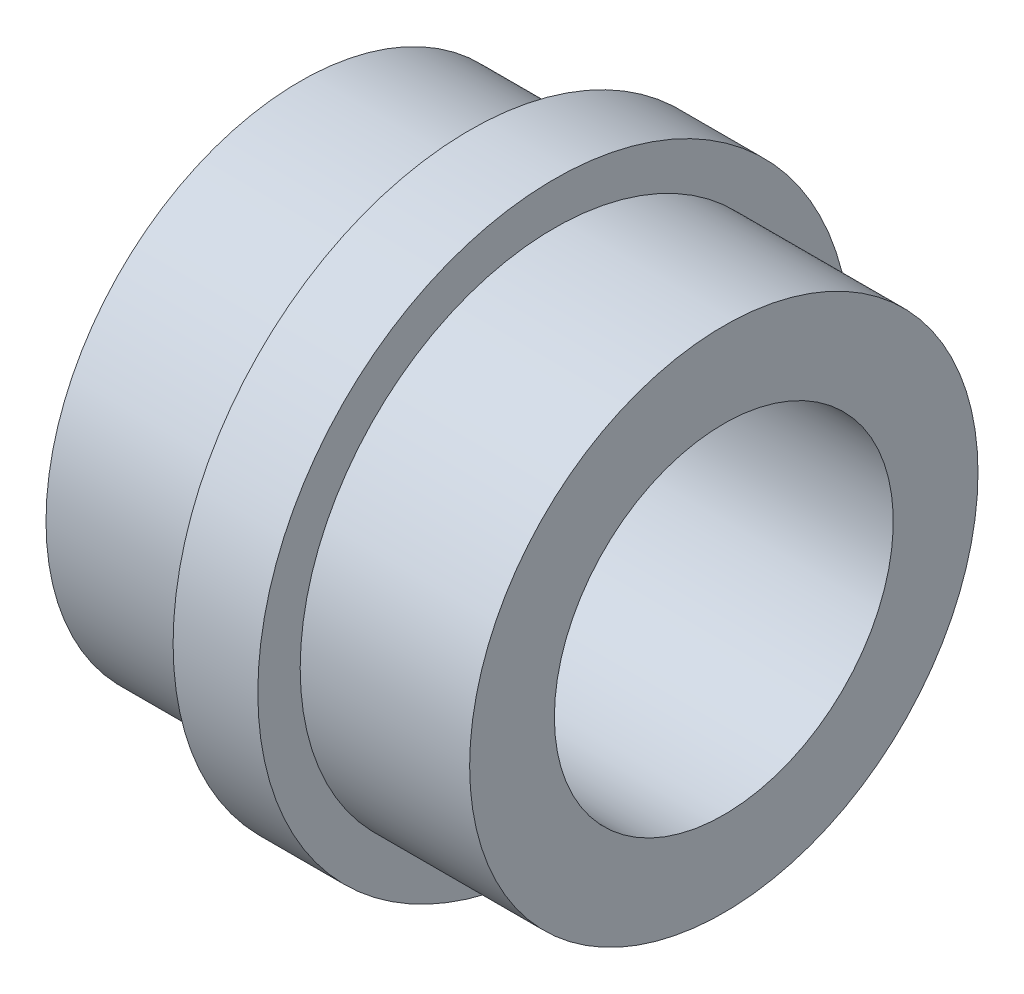
ISO-10303-21;
HEADER;
FILE_DESCRIPTION(('STEP AP214'),'2;1');
FILE_NAME('part.step','',(''),(''),'','','');
FILE_SCHEMA(('AUTOMOTIVE_DESIGN { 1 0 10303 214 1 1 1 1 }'));
ENDSEC;
DATA;
#1=APPLICATION_CONTEXT('core data for automotive mechanical design processes');
#2=APPLICATION_PROTOCOL_DEFINITION('international standard','automotive_design',2000,#1);
#3=PRODUCT_CONTEXT('',#1,'mechanical');
#4=PRODUCT('Part','Part','',(#3));
#5=PRODUCT_RELATED_PRODUCT_CATEGORY('part','',(#4));
#6=PRODUCT_DEFINITION_FORMATION('','',#4);
#7=PRODUCT_DEFINITION_CONTEXT('part definition',#1,'design');
#8=PRODUCT_DEFINITION('design','',#6,#7);
#9=PRODUCT_DEFINITION_SHAPE('','',#8);
#10=(LENGTH_UNIT() NAMED_UNIT(*) SI_UNIT(.MILLI.,.METRE.));
#11=(NAMED_UNIT(*) PLANE_ANGLE_UNIT() SI_UNIT($,.RADIAN.));
#12=(NAMED_UNIT(*) SI_UNIT($,.STERADIAN.) SOLID_ANGLE_UNIT());
#13=UNCERTAINTY_MEASURE_WITH_UNIT(LENGTH_MEASURE(1.E-05),#10,'distance_accuracy_value','');
#14=(GEOMETRIC_REPRESENTATION_CONTEXT(3) GLOBAL_UNCERTAINTY_ASSIGNED_CONTEXT((#13)) GLOBAL_UNIT_ASSIGNED_CONTEXT((#10,
#11,#12)) REPRESENTATION_CONTEXT('',''));
#15=CARTESIAN_POINT('',(0.,0.,0.));
#16=DIRECTION('',(0.,0.,1.));
#17=DIRECTION('',(1.,0.,0.));
#18=AXIS2_PLACEMENT_3D('',#15,#16,#17);
#19=CARTESIAN_POINT('',(0.,0.,-20.));
#20=DIRECTION('',(-1.,0.,0.));
#21=DIRECTION('',(0.,0.,1.));
#22=AXIS2_PLACEMENT_3D('',#19,#20,#21);
#23=PLANE('',#22);
#24=CARTESIAN_POINT('',(0.,0.,0.));
#25=DIRECTION('',(-1.,0.,0.));
#26=DIRECTION('',(0.,0.,1.));
#27=AXIS2_PLACEMENT_3D('',#24,#25,#26);
#28=CIRCLE('',#27,30.);
#29=CARTESIAN_POINT('',(0.,0.,30.));
#30=VERTEX_POINT('',#29);
#31=EDGE_CURVE('E10',#30,#30,#28,.T.);
#32=ORIENTED_EDGE('',*,*,#31,.T.);
#33=EDGE_LOOP('',(#32));
#34=FACE_BOUND('',#33,.T.);
#35=CARTESIAN_POINT('',(0.,0.,0.));
#36=DIRECTION('',(-1.,0.,0.));
#37=DIRECTION('',(0.,0.,1.));
#38=AXIS2_PLACEMENT_3D('',#35,#36,#37);
#39=CIRCLE('',#38,20.);
#40=CARTESIAN_POINT('',(0.,0.,20.));
#41=VERTEX_POINT('',#40);
#42=EDGE_CURVE('E58',#41,#41,#39,.T.);
#43=ORIENTED_EDGE('',*,*,#42,.F.);
#44=EDGE_LOOP('',(#43));
#45=FACE_BOUND('',#44,.T.);
#46=ADVANCED_FACE('F30',(#34,#45),#23,.T.);
#47=CARTESIAN_POINT('',(0.,0.,0.));
#48=DIRECTION('',(-1.,0.,0.));
#49=DIRECTION('',(0.,0.,1.));
#50=AXIS2_PLACEMENT_3D('',#47,#48,#49);
#51=CYLINDRICAL_SURFACE('',#50,30.);
#52=CARTESIAN_POINT('',(20.,0.,0.));
#53=DIRECTION('',(-1.,0.,0.));
#54=DIRECTION('',(0.,0.,1.));
#55=AXIS2_PLACEMENT_3D('',#52,#53,#54);
#56=CIRCLE('',#55,30.);
#57=CARTESIAN_POINT('',(20.,0.,30.));
#58=VERTEX_POINT('',#57);
#59=EDGE_CURVE('E36',#58,#58,#56,.T.);
#60=ORIENTED_EDGE('',*,*,#59,.T.);
#61=EDGE_LOOP('',(#60));
#62=FACE_BOUND('',#61,.T.);
#63=ORIENTED_EDGE('',*,*,#31,.F.);
#64=EDGE_LOOP('',(#63));
#65=FACE_BOUND('',#64,.T.);
#66=ADVANCED_FACE('F65',(#62,#65),#51,.T.);
#67=CARTESIAN_POINT('',(20.,0.,-30.));
#68=DIRECTION('',(-1.,0.,0.));
#69=DIRECTION('',(0.,0.,1.));
#70=AXIS2_PLACEMENT_3D('',#67,#68,#69);
#71=PLANE('',#70);
#72=CARTESIAN_POINT('',(20.,0.,0.));
#73=DIRECTION('',(-1.,0.,0.));
#74=DIRECTION('',(0.,0.,1.));
#75=AXIS2_PLACEMENT_3D('',#72,#73,#74);
#76=CIRCLE('',#75,35.);
#77=CARTESIAN_POINT('',(20.,0.,35.));
#78=VERTEX_POINT('',#77);
#79=EDGE_CURVE('E40',#78,#78,#76,.T.);
#80=ORIENTED_EDGE('',*,*,#79,.T.);
#81=EDGE_LOOP('',(#80));
#82=FACE_BOUND('',#81,.T.);
#83=ORIENTED_EDGE('',*,*,#59,.F.);
#84=EDGE_LOOP('',(#83));
#85=FACE_BOUND('',#84,.T.);
#86=ADVANCED_FACE('F69',(#82,#85),#71,.T.);
#87=CARTESIAN_POINT('',(0.,0.,0.));
#88=DIRECTION('',(-1.,0.,0.));
#89=DIRECTION('',(0.,0.,1.));
#90=AXIS2_PLACEMENT_3D('',#87,#88,#89);
#91=CYLINDRICAL_SURFACE('',#90,35.);
#92=CARTESIAN_POINT('',(30.,0.,0.));
#93=DIRECTION('',(-1.,0.,0.));
#94=DIRECTION('',(0.,0.,1.));
#95=AXIS2_PLACEMENT_3D('',#92,#93,#94);
#96=CIRCLE('',#95,35.);
#97=CARTESIAN_POINT('',(30.,0.,35.));
#98=VERTEX_POINT('',#97);
#99=EDGE_CURVE('E44',#98,#98,#96,.T.);
#100=ORIENTED_EDGE('',*,*,#99,.T.);
#101=EDGE_LOOP('',(#100));
#102=FACE_BOUND('',#101,.T.);
#103=ORIENTED_EDGE('',*,*,#79,.F.);
#104=EDGE_LOOP('',(#103));
#105=FACE_BOUND('',#104,.T.);
#106=ADVANCED_FACE('F73',(#102,#105),#91,.T.);
#107=CARTESIAN_POINT('',(30.,0.,-30.));
#108=DIRECTION('',(-1.,0.,0.));
#109=DIRECTION('',(0.,0.,1.));
#110=AXIS2_PLACEMENT_3D('',#107,#108,#109);
#111=PLANE('',#110);
#112=ORIENTED_EDGE('',*,*,#99,.F.);
#113=EDGE_LOOP('',(#112));
#114=FACE_BOUND('',#113,.T.);
#115=CARTESIAN_POINT('',(30.,0.,0.));
#116=DIRECTION('',(-1.,0.,0.));
#117=DIRECTION('',(0.,0.,1.));
#118=AXIS2_PLACEMENT_3D('',#115,#116,#117);
#119=CIRCLE('',#118,30.);
#120=CARTESIAN_POINT('',(30.,0.,30.));
#121=VERTEX_POINT('',#120);
#122=EDGE_CURVE('E49',#121,#121,#119,.T.);
#123=ORIENTED_EDGE('',*,*,#122,.T.);
#124=EDGE_LOOP('',(#123));
#125=FACE_BOUND('',#124,.T.);
#126=ADVANCED_FACE('F80',(#114,#125),#111,.F.);
#127=CARTESIAN_POINT('',(0.,0.,0.));
#128=DIRECTION('',(-1.,0.,0.));
#129=DIRECTION('',(0.,0.,1.));
#130=AXIS2_PLACEMENT_3D('',#127,#128,#129);
#131=CYLINDRICAL_SURFACE('',#130,30.);
#132=CARTESIAN_POINT('',(50.,0.,0.));
#133=DIRECTION('',(-1.,0.,0.));
#134=DIRECTION('',(0.,0.,1.));
#135=AXIS2_PLACEMENT_3D('',#132,#133,#134);
#136=CIRCLE('',#135,30.);
#137=CARTESIAN_POINT('',(50.,0.,30.));
#138=VERTEX_POINT('',#137);
#139=EDGE_CURVE('E52',#138,#138,#136,.T.);
#140=ORIENTED_EDGE('',*,*,#139,.T.);
#141=EDGE_LOOP('',(#140));
#142=FACE_BOUND('',#141,.T.);
#143=ORIENTED_EDGE('',*,*,#122,.F.);
#144=EDGE_LOOP('',(#143));
#145=FACE_BOUND('',#144,.T.);
#146=ADVANCED_FACE('F84',(#142,#145),#131,.T.);
#147=CARTESIAN_POINT('',(50.,0.,-20.));
#148=DIRECTION('',(-1.,0.,0.));
#149=DIRECTION('',(0.,0.,1.));
#150=AXIS2_PLACEMENT_3D('',#147,#148,#149);
#151=PLANE('',#150);
#152=ORIENTED_EDGE('',*,*,#139,.F.);
#153=EDGE_LOOP('',(#152));
#154=FACE_BOUND('',#153,.T.);
#155=CARTESIAN_POINT('',(50.,0.,0.));
#156=DIRECTION('',(-1.,0.,0.));
#157=DIRECTION('',(0.,0.,1.));
#158=AXIS2_PLACEMENT_3D('',#155,#156,#157);
#159=CIRCLE('',#158,20.);
#160=CARTESIAN_POINT('',(50.,0.,20.));
#161=VERTEX_POINT('',#160);
#162=EDGE_CURVE('E55',#161,#161,#159,.T.);
#163=ORIENTED_EDGE('',*,*,#162,.T.);
#164=EDGE_LOOP('',(#163));
#165=FACE_BOUND('',#164,.T.);
#166=ADVANCED_FACE('F88',(#154,#165),#151,.F.);
#167=CARTESIAN_POINT('',(0.,0.,0.));
#168=DIRECTION('',(-1.,0.,0.));
#169=DIRECTION('',(0.,0.,1.));
#170=AXIS2_PLACEMENT_3D('',#167,#168,#169);
#171=CYLINDRICAL_SURFACE('',#170,20.);
#172=ORIENTED_EDGE('',*,*,#162,.F.);
#173=EDGE_LOOP('',(#172));
#174=FACE_BOUND('',#173,.T.);
#175=ORIENTED_EDGE('',*,*,#42,.T.);
#176=EDGE_LOOP('',(#175));
#177=FACE_BOUND('',#176,.T.);
#178=ADVANCED_FACE('F62',(#174,#177),#171,.F.);
#179=CLOSED_SHELL('',(#46,#66,#86,#106,#126,#146,#166,#178));
#180=MANIFOLD_SOLID_BREP('B2',#179);
#181=ADVANCED_BREP_SHAPE_REPRESENTATION('',(#18,#180),#14);
#182=SHAPE_DEFINITION_REPRESENTATION(#9,#181);
ENDSEC;
END-ISO-10303-21;
